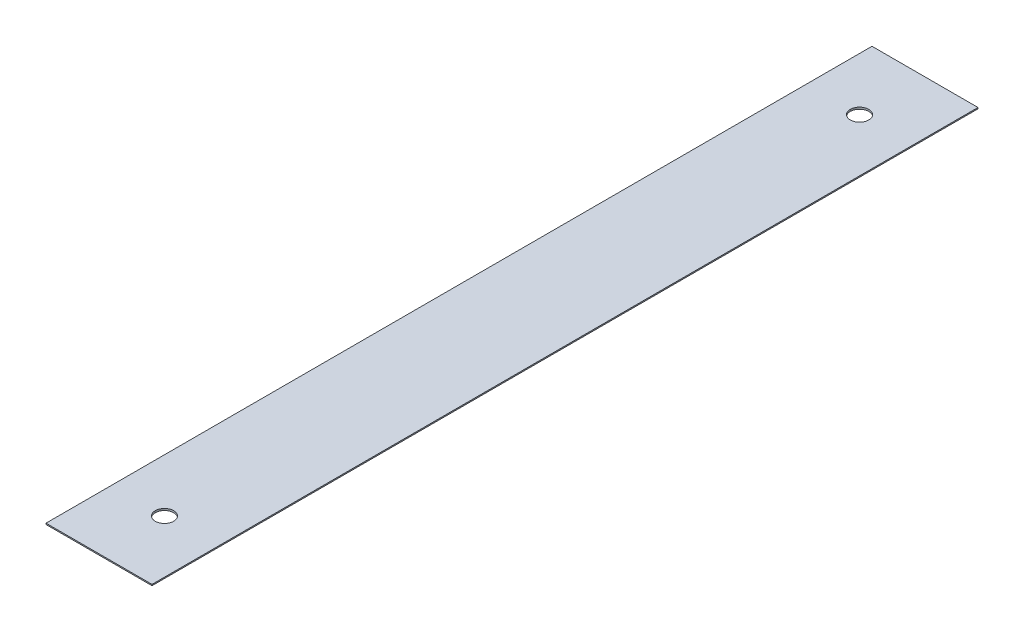
ISO-10303-21;
HEADER;
FILE_DESCRIPTION(('STEP AP214'),'2;1');
FILE_NAME('part.step','',(''),(''),'','','');
FILE_SCHEMA(('AUTOMOTIVE_DESIGN { 1 0 10303 214 1 1 1 1 }'));
ENDSEC;
DATA;
#1=APPLICATION_CONTEXT('core data for automotive mechanical design processes');
#2=APPLICATION_PROTOCOL_DEFINITION('international standard','automotive_design',2000,#1);
#3=PRODUCT_CONTEXT('',#1,'mechanical');
#4=PRODUCT('Part','Part','',(#3));
#5=PRODUCT_RELATED_PRODUCT_CATEGORY('part','',(#4));
#6=PRODUCT_DEFINITION_FORMATION('','',#4);
#7=PRODUCT_DEFINITION_CONTEXT('part definition',#1,'design');
#8=PRODUCT_DEFINITION('design','',#6,#7);
#9=PRODUCT_DEFINITION_SHAPE('','',#8);
#10=(LENGTH_UNIT() NAMED_UNIT(*) SI_UNIT(.MILLI.,.METRE.));
#11=(NAMED_UNIT(*) PLANE_ANGLE_UNIT() SI_UNIT($,.RADIAN.));
#12=(NAMED_UNIT(*) SI_UNIT($,.STERADIAN.) SOLID_ANGLE_UNIT());
#13=UNCERTAINTY_MEASURE_WITH_UNIT(LENGTH_MEASURE(1.E-05),#10,'distance_accuracy_value','');
#14=(GEOMETRIC_REPRESENTATION_CONTEXT(3) GLOBAL_UNCERTAINTY_ASSIGNED_CONTEXT((#13)) GLOBAL_UNIT_ASSIGNED_CONTEXT((#10,
#11,#12)) REPRESENTATION_CONTEXT('',''));
#15=CARTESIAN_POINT('',(0.,0.,0.));
#16=DIRECTION('',(0.,0.,1.));
#17=DIRECTION('',(1.,0.,0.));
#18=AXIS2_PLACEMENT_3D('',#15,#16,#17);
#19=CARTESIAN_POINT('',(-260.,-1088.5,1915.));
#20=DIRECTION('',(0.,-1.,0.));
#21=DIRECTION('',(0.,0.,1.));
#22=AXIS2_PLACEMENT_3D('',#19,#20,#21);
#23=PLANE('',#22);
#24=DIRECTION('',(-1.,0.,0.));
#25=VECTOR('',#24,1.);
#26=CARTESIAN_POINT('',(688.3,-1088.5,1732.3));
#27=LINE('',#26,#25);
#28=CARTESIAN_POINT('',(688.3,-1088.5,1732.3));
#29=VERTEX_POINT('',#28);
#30=CARTESIAN_POINT('',(574.7,-1088.5,1732.3));
#31=VERTEX_POINT('',#30);
#32=EDGE_CURVE('E11',#29,#31,#27,.T.);
#33=ORIENTED_EDGE('',*,*,#32,.T.);
#34=DIRECTION('',(0.,0.,-1.));
#35=VECTOR('',#34,1.);
#36=CARTESIAN_POINT('',(574.7,-1088.5,1732.3));
#37=LINE('',#36,#35);
#38=CARTESIAN_POINT('',(574.7,-1088.5,837.7));
#39=VERTEX_POINT('',#38);
#40=EDGE_CURVE('E27',#31,#39,#37,.T.);
#41=ORIENTED_EDGE('',*,*,#40,.T.);
#42=DIRECTION('',(1.,0.,0.));
#43=VECTOR('',#42,1.);
#44=CARTESIAN_POINT('',(574.7,-1088.5,837.7));
#45=LINE('',#44,#43);
#46=CARTESIAN_POINT('',(688.3,-1088.5,837.7));
#47=VERTEX_POINT('',#46);
#48=EDGE_CURVE('E134',#39,#47,#45,.T.);
#49=ORIENTED_EDGE('',*,*,#48,.T.);
#50=DIRECTION('',(0.,0.,1.));
#51=VECTOR('',#50,1.);
#52=CARTESIAN_POINT('',(688.3,-1088.5,837.7));
#53=LINE('',#52,#51);
#54=EDGE_CURVE('E171',#47,#29,#53,.T.);
#55=ORIENTED_EDGE('',*,*,#54,.T.);
#56=EDGE_LOOP('',(#33,#41,#49,#55));
#57=FACE_BOUND('',#56,.T.);
#58=CARTESIAN_POINT('',(631.5,-1088.5,1662.));
#59=DIRECTION('',(0.,-1.,0.));
#60=DIRECTION('',(-1.,0.,0.));
#61=AXIS2_PLACEMENT_3D('',#58,#59,#60);
#62=CIRCLE('',#61,10.);
#63=CARTESIAN_POINT('',(621.5,-1088.5,1662.));
#64=VERTEX_POINT('',#63);
#65=CARTESIAN_POINT('',(641.5,-1088.5,1662.));
#66=VERTEX_POINT('',#65);
#67=EDGE_CURVE('E139',#64,#66,#62,.T.);
#68=ORIENTED_EDGE('',*,*,#67,.F.);
#69=CARTESIAN_POINT('',(631.5,-1088.5,1662.));
#70=DIRECTION('',(0.,-1.,0.));
#71=DIRECTION('',(1.,0.,0.));
#72=AXIS2_PLACEMENT_3D('',#69,#70,#71);
#73=CIRCLE('',#72,10.);
#74=EDGE_CURVE('E138',#66,#64,#73,.T.);
#75=ORIENTED_EDGE('',*,*,#74,.F.);
#76=EDGE_LOOP('',(#68,#75));
#77=FACE_BOUND('',#76,.T.);
#78=CARTESIAN_POINT('',(631.5,-1088.5,908.));
#79=DIRECTION('',(0.,-1.,0.));
#80=DIRECTION('',(-1.,0.,0.));
#81=AXIS2_PLACEMENT_3D('',#78,#79,#80);
#82=CIRCLE('',#81,10.);
#83=CARTESIAN_POINT('',(621.5,-1088.5,908.));
#84=VERTEX_POINT('',#83);
#85=CARTESIAN_POINT('',(641.5,-1088.5,908.));
#86=VERTEX_POINT('',#85);
#87=EDGE_CURVE('E164',#84,#86,#82,.T.);
#88=ORIENTED_EDGE('',*,*,#87,.F.);
#89=CARTESIAN_POINT('',(631.5,-1088.5,908.));
#90=DIRECTION('',(0.,-1.,0.));
#91=DIRECTION('',(1.,0.,0.));
#92=AXIS2_PLACEMENT_3D('',#89,#90,#91);
#93=CIRCLE('',#92,10.);
#94=EDGE_CURVE('E177',#86,#84,#93,.T.);
#95=ORIENTED_EDGE('',*,*,#94,.F.);
#96=EDGE_LOOP('',(#88,#95));
#97=FACE_BOUND('',#96,.T.);
#98=ADVANCED_FACE('F17',(#57,#77,#97),#23,.T.);
#99=CARTESIAN_POINT('',(631.5,-1088.5,1662.));
#100=DIRECTION('',(0.,-1.,0.));
#101=DIRECTION('',(1.,0.,0.));
#102=AXIS2_PLACEMENT_3D('',#99,#100,#101);
#103=CYLINDRICAL_SURFACE('',#102,10.);
#104=DIRECTION('',(0.,1.,0.));
#105=VECTOR('',#104,1.);
#106=CARTESIAN_POINT('',(621.5,-1088.5,1662.));
#107=LINE('',#106,#105);
#108=CARTESIAN_POINT('',(621.5,-1086.5,1662.));
#109=VERTEX_POINT('',#108);
#110=EDGE_CURVE('E173',#64,#109,#107,.T.);
#111=ORIENTED_EDGE('',*,*,#110,.T.);
#112=CARTESIAN_POINT('',(631.5,-1086.5,1662.));
#113=DIRECTION('',(0.,-1.,0.));
#114=DIRECTION('',(1.,0.,0.));
#115=AXIS2_PLACEMENT_3D('',#112,#113,#114);
#116=CIRCLE('',#115,10.);
#117=CARTESIAN_POINT('',(641.5,-1086.5,1662.));
#118=VERTEX_POINT('',#117);
#119=EDGE_CURVE('E131',#118,#109,#116,.T.);
#120=ORIENTED_EDGE('',*,*,#119,.F.);
#121=DIRECTION('',(0.,1.,0.));
#122=VECTOR('',#121,1.);
#123=CARTESIAN_POINT('',(641.5,-1088.5,1662.));
#124=LINE('',#123,#122);
#125=EDGE_CURVE('E135',#66,#118,#124,.T.);
#126=ORIENTED_EDGE('',*,*,#125,.F.);
#127=ORIENTED_EDGE('',*,*,#74,.T.);
#128=EDGE_LOOP('',(#111,#120,#126,#127));
#129=FACE_BOUND('',#128,.T.);
#130=ADVANCED_FACE('F206',(#129),#103,.F.);
#131=CARTESIAN_POINT('',(631.5,-1088.5,1662.));
#132=DIRECTION('',(0.,-1.,0.));
#133=DIRECTION('',(1.,0.,0.));
#134=AXIS2_PLACEMENT_3D('',#131,#132,#133);
#135=CYLINDRICAL_SURFACE('',#134,10.);
#136=ORIENTED_EDGE('',*,*,#125,.T.);
#137=CARTESIAN_POINT('',(631.5,-1086.5,1662.));
#138=DIRECTION('',(0.,-1.,0.));
#139=DIRECTION('',(-1.,0.,0.));
#140=AXIS2_PLACEMENT_3D('',#137,#138,#139);
#141=CIRCLE('',#140,10.);
#142=EDGE_CURVE('E126',#109,#118,#141,.T.);
#143=ORIENTED_EDGE('',*,*,#142,.F.);
#144=ORIENTED_EDGE('',*,*,#110,.F.);
#145=ORIENTED_EDGE('',*,*,#67,.T.);
#146=EDGE_LOOP('',(#136,#143,#144,#145));
#147=FACE_BOUND('',#146,.T.);
#148=ADVANCED_FACE('F212',(#147),#135,.F.);
#149=CARTESIAN_POINT('',(-260.,-1086.5,1915.));
#150=DIRECTION('',(0.,-1.,0.));
#151=DIRECTION('',(0.,0.,1.));
#152=AXIS2_PLACEMENT_3D('',#149,#150,#151);
#153=PLANE('',#152);
#154=DIRECTION('',(0.,0.,-1.));
#155=VECTOR('',#154,1.);
#156=CARTESIAN_POINT('',(574.,-1086.5,1733.));
#157=LINE('',#156,#155);
#158=CARTESIAN_POINT('',(574.,-1086.5,1733.));
#159=VERTEX_POINT('',#158);
#160=CARTESIAN_POINT('',(574.,-1086.5,837.));
#161=VERTEX_POINT('',#160);
#162=EDGE_CURVE('E112',#159,#161,#157,.T.);
#163=ORIENTED_EDGE('',*,*,#162,.F.);
#164=DIRECTION('',(-1.,0.,0.));
#165=VECTOR('',#164,1.);
#166=CARTESIAN_POINT('',(689.,-1086.5,1733.));
#167=LINE('',#166,#165);
#168=CARTESIAN_POINT('',(689.,-1086.5,1733.));
#169=VERTEX_POINT('',#168);
#170=EDGE_CURVE('E99',#169,#159,#167,.T.);
#171=ORIENTED_EDGE('',*,*,#170,.F.);
#172=DIRECTION('',(0.,0.,1.));
#173=VECTOR('',#172,1.);
#174=CARTESIAN_POINT('',(689.,-1086.5,837.));
#175=LINE('',#174,#173);
#176=CARTESIAN_POINT('',(689.,-1086.5,837.));
#177=VERTEX_POINT('',#176);
#178=EDGE_CURVE('E151',#177,#169,#175,.T.);
#179=ORIENTED_EDGE('',*,*,#178,.F.);
#180=DIRECTION('',(1.,0.,0.));
#181=VECTOR('',#180,1.);
#182=CARTESIAN_POINT('',(574.,-1086.5,837.));
#183=LINE('',#182,#181);
#184=EDGE_CURVE('E153',#161,#177,#183,.T.);
#185=ORIENTED_EDGE('',*,*,#184,.F.);
#186=EDGE_LOOP('',(#163,#171,#179,#185));
#187=FACE_BOUND('',#186,.T.);
#188=ORIENTED_EDGE('',*,*,#142,.T.);
#189=ORIENTED_EDGE('',*,*,#119,.T.);
#190=EDGE_LOOP('',(#188,#189));
#191=FACE_BOUND('',#190,.T.);
#192=CARTESIAN_POINT('',(631.5,-1086.5,908.));
#193=DIRECTION('',(0.,-1.,0.));
#194=DIRECTION('',(-1.,0.,0.));
#195=AXIS2_PLACEMENT_3D('',#192,#193,#194);
#196=CIRCLE('',#195,10.);
#197=CARTESIAN_POINT('',(621.5,-1086.5,908.));
#198=VERTEX_POINT('',#197);
#199=CARTESIAN_POINT('',(641.5,-1086.5,908.));
#200=VERTEX_POINT('',#199);
#201=EDGE_CURVE('E128',#198,#200,#196,.T.);
#202=ORIENTED_EDGE('',*,*,#201,.T.);
#203=CARTESIAN_POINT('',(631.5,-1086.5,908.));
#204=DIRECTION('',(0.,-1.,0.));
#205=DIRECTION('',(1.,0.,0.));
#206=AXIS2_PLACEMENT_3D('',#203,#204,#205);
#207=CIRCLE('',#206,10.);
#208=EDGE_CURVE('E132',#200,#198,#207,.T.);
#209=ORIENTED_EDGE('',*,*,#208,.T.);
#210=EDGE_LOOP('',(#202,#209));
#211=FACE_BOUND('',#210,.T.);
#212=ADVANCED_FACE('F183',(#187,#191,#211),#153,.F.);
#213=CARTESIAN_POINT('',(574.,-1088.5,837.));
#214=DIRECTION('',(0.,0.,-1.));
#215=DIRECTION('',(1.,0.,0.));
#216=AXIS2_PLACEMENT_3D('',#213,#214,#215);
#217=PLANE('',#216);
#218=DIRECTION('',(0.,1.,0.));
#219=VECTOR('',#218,1.);
#220=CARTESIAN_POINT('',(574.,-1087.8,837.));
#221=LINE('',#220,#219);
#222=CARTESIAN_POINT('',(574.,-1087.8,837.));
#223=VERTEX_POINT('',#222);
#224=EDGE_CURVE('E117',#223,#161,#221,.T.);
#225=ORIENTED_EDGE('',*,*,#224,.T.);
#226=ORIENTED_EDGE('',*,*,#184,.T.);
#227=DIRECTION('',(0.,1.,0.));
#228=VECTOR('',#227,1.);
#229=CARTESIAN_POINT('',(689.,-1087.8,837.));
#230=LINE('',#229,#228);
#231=CARTESIAN_POINT('',(689.,-1087.8,837.));
#232=VERTEX_POINT('',#231);
#233=EDGE_CURVE('E148',#232,#177,#230,.T.);
#234=ORIENTED_EDGE('',*,*,#233,.F.);
#235=DIRECTION('',(1.,0.,0.));
#236=VECTOR('',#235,1.);
#237=CARTESIAN_POINT('',(574.,-1087.8,837.));
#238=LINE('',#237,#236);
#239=EDGE_CURVE('E118',#223,#232,#238,.T.);
#240=ORIENTED_EDGE('',*,*,#239,.F.);
#241=EDGE_LOOP('',(#225,#226,#234,#240));
#242=FACE_BOUND('',#241,.T.);
#243=ADVANCED_FACE('F186',(#242),#217,.T.);
#244=CARTESIAN_POINT('',(631.5,-1088.15,837.35));
#245=DIRECTION('',(0.,-0.707106781186598,-0.707106781186498));
#246=DIRECTION('',(1.,0.,0.));
#247=AXIS2_PLACEMENT_3D('',#244,#245,#246);
#248=PLANE('',#247);
#249=DIRECTION('',(-0.577350269189626,-0.577350269189626,0.577350269189626));
#250=VECTOR('',#249,1.);
#251=CARTESIAN_POINT('',(689.,-1087.8,837.));
#252=LINE('',#251,#250);
#253=EDGE_CURVE('E145',#232,#47,#252,.T.);
#254=ORIENTED_EDGE('',*,*,#253,.T.);
#255=ORIENTED_EDGE('',*,*,#48,.F.);
#256=DIRECTION('',(0.577350269189592,-0.577350269189592,0.577350269189693));
#257=VECTOR('',#256,1.);
#258=CARTESIAN_POINT('',(574.,-1087.8,837.));
#259=LINE('',#258,#257);
#260=EDGE_CURVE('E111',#223,#39,#259,.T.);
#261=ORIENTED_EDGE('',*,*,#260,.F.);
#262=ORIENTED_EDGE('',*,*,#239,.T.);
#263=EDGE_LOOP('',(#254,#255,#261,#262));
#264=FACE_BOUND('',#263,.T.);
#265=ADVANCED_FACE('F187',(#264),#248,.T.);
#266=CARTESIAN_POINT('',(574.35,-1088.15,1285.));
#267=DIRECTION('',(-0.707106781186498,-0.707106781186598,0.));
#268=DIRECTION('',(0.,0.,-1.));
#269=AXIS2_PLACEMENT_3D('',#266,#267,#268);
#270=PLANE('',#269);
#271=DIRECTION('',(0.577350269189626,-0.577350269189626,-0.577350269189626));
#272=VECTOR('',#271,1.);
#273=CARTESIAN_POINT('',(574.,-1087.8,1733.));
#274=LINE('',#273,#272);
#275=CARTESIAN_POINT('',(574.,-1087.8,1733.));
#276=VERTEX_POINT('',#275);
#277=EDGE_CURVE('E94',#276,#31,#274,.T.);
#278=ORIENTED_EDGE('',*,*,#277,.F.);
#279=DIRECTION('',(0.,0.,-1.));
#280=VECTOR('',#279,1.);
#281=CARTESIAN_POINT('',(574.,-1087.8,1733.));
#282=LINE('',#281,#280);
#283=EDGE_CURVE('E98',#276,#223,#282,.T.);
#284=ORIENTED_EDGE('',*,*,#283,.T.);
#285=ORIENTED_EDGE('',*,*,#260,.T.);
#286=ORIENTED_EDGE('',*,*,#40,.F.);
#287=EDGE_LOOP('',(#278,#284,#285,#286));
#288=FACE_BOUND('',#287,.T.);
#289=ADVANCED_FACE('F96',(#288),#270,.T.);
#290=CARTESIAN_POINT('',(574.,-1088.5,1733.));
#291=DIRECTION('',(-1.,0.,0.));
#292=DIRECTION('',(0.,-1.,0.));
#293=AXIS2_PLACEMENT_3D('',#290,#291,#292);
#294=PLANE('',#293);
#295=DIRECTION('',(0.,1.,0.));
#296=VECTOR('',#295,1.);
#297=CARTESIAN_POINT('',(574.,-1087.8,1733.));
#298=LINE('',#297,#296);
#299=EDGE_CURVE('E104',#276,#159,#298,.T.);
#300=ORIENTED_EDGE('',*,*,#299,.T.);
#301=ORIENTED_EDGE('',*,*,#162,.T.);
#302=ORIENTED_EDGE('',*,*,#224,.F.);
#303=ORIENTED_EDGE('',*,*,#283,.F.);
#304=EDGE_LOOP('',(#300,#301,#302,#303));
#305=FACE_BOUND('',#304,.T.);
#306=ADVANCED_FACE('F115',(#305),#294,.T.);
#307=CARTESIAN_POINT('',(689.,-1088.5,1733.));
#308=DIRECTION('',(0.,0.,1.));
#309=DIRECTION('',(0.,-1.,0.));
#310=AXIS2_PLACEMENT_3D('',#307,#308,#309);
#311=PLANE('',#310);
#312=DIRECTION('',(0.,1.,0.));
#313=VECTOR('',#312,1.);
#314=CARTESIAN_POINT('',(689.,-1087.8,1733.));
#315=LINE('',#314,#313);
#316=CARTESIAN_POINT('',(689.,-1087.8,1733.));
#317=VERTEX_POINT('',#316);
#318=EDGE_CURVE('E141',#317,#169,#315,.T.);
#319=ORIENTED_EDGE('',*,*,#318,.T.);
#320=ORIENTED_EDGE('',*,*,#170,.T.);
#321=ORIENTED_EDGE('',*,*,#299,.F.);
#322=DIRECTION('',(-1.,0.,0.));
#323=VECTOR('',#322,1.);
#324=CARTESIAN_POINT('',(689.,-1087.8,1733.));
#325=LINE('',#324,#323);
#326=EDGE_CURVE('E100',#317,#276,#325,.T.);
#327=ORIENTED_EDGE('',*,*,#326,.F.);
#328=EDGE_LOOP('',(#319,#320,#321,#327));
#329=FACE_BOUND('',#328,.T.);
#330=ADVANCED_FACE('F106',(#329),#311,.T.);
#331=CARTESIAN_POINT('',(631.5,-1088.15,1732.65));
#332=DIRECTION('',(0.,-0.707106781186498,0.707106781186598));
#333=DIRECTION('',(1.,0.,0.));
#334=AXIS2_PLACEMENT_3D('',#331,#332,#333);
#335=PLANE('',#334);
#336=ORIENTED_EDGE('',*,*,#277,.T.);
#337=ORIENTED_EDGE('',*,*,#32,.F.);
#338=DIRECTION('',(-0.577350269189693,-0.577350269189592,-0.577350269189592));
#339=VECTOR('',#338,1.);
#340=CARTESIAN_POINT('',(689.,-1087.8,1733.));
#341=LINE('',#340,#339);
#342=EDGE_CURVE('E90',#317,#29,#341,.T.);
#343=ORIENTED_EDGE('',*,*,#342,.F.);
#344=ORIENTED_EDGE('',*,*,#326,.T.);
#345=EDGE_LOOP('',(#336,#337,#343,#344));
#346=FACE_BOUND('',#345,.T.);
#347=ADVANCED_FACE('F120',(#346),#335,.T.);
#348=CARTESIAN_POINT('',(688.65,-1088.15,1285.));
#349=DIRECTION('',(0.707106781186498,-0.707106781186598,0.));
#350=DIRECTION('',(0.,0.,-1.));
#351=AXIS2_PLACEMENT_3D('',#348,#349,#350);
#352=PLANE('',#351);
#353=ORIENTED_EDGE('',*,*,#342,.T.);
#354=ORIENTED_EDGE('',*,*,#54,.F.);
#355=ORIENTED_EDGE('',*,*,#253,.F.);
#356=DIRECTION('',(0.,0.,1.));
#357=VECTOR('',#356,1.);
#358=CARTESIAN_POINT('',(689.,-1087.8,837.));
#359=LINE('',#358,#357);
#360=EDGE_CURVE('E122',#232,#317,#359,.T.);
#361=ORIENTED_EDGE('',*,*,#360,.T.);
#362=EDGE_LOOP('',(#353,#354,#355,#361));
#363=FACE_BOUND('',#362,.T.);
#364=ADVANCED_FACE('F190',(#363),#352,.T.);
#365=CARTESIAN_POINT('',(689.,-1088.5,837.));
#366=DIRECTION('',(1.,0.,0.));
#367=DIRECTION('',(0.,0.,-1.));
#368=AXIS2_PLACEMENT_3D('',#365,#366,#367);
#369=PLANE('',#368);
#370=ORIENTED_EDGE('',*,*,#233,.T.);
#371=ORIENTED_EDGE('',*,*,#178,.T.);
#372=ORIENTED_EDGE('',*,*,#318,.F.);
#373=ORIENTED_EDGE('',*,*,#360,.F.);
#374=EDGE_LOOP('',(#370,#371,#372,#373));
#375=FACE_BOUND('',#374,.T.);
#376=ADVANCED_FACE('F192',(#375),#369,.T.);
#377=CARTESIAN_POINT('',(631.5,-1088.5,908.));
#378=DIRECTION('',(0.,-1.,0.));
#379=DIRECTION('',(1.,0.,0.));
#380=AXIS2_PLACEMENT_3D('',#377,#378,#379);
#381=CYLINDRICAL_SURFACE('',#380,10.);
#382=DIRECTION('',(0.,1.,0.));
#383=VECTOR('',#382,1.);
#384=CARTESIAN_POINT('',(621.5,-1088.5,908.));
#385=LINE('',#384,#383);
#386=EDGE_CURVE('E174',#84,#198,#385,.T.);
#387=ORIENTED_EDGE('',*,*,#386,.T.);
#388=ORIENTED_EDGE('',*,*,#208,.F.);
#389=DIRECTION('',(0.,1.,0.));
#390=VECTOR('',#389,1.);
#391=CARTESIAN_POINT('',(641.5,-1088.5,908.));
#392=LINE('',#391,#390);
#393=EDGE_CURVE('E21',#86,#200,#392,.T.);
#394=ORIENTED_EDGE('',*,*,#393,.F.);
#395=ORIENTED_EDGE('',*,*,#94,.T.);
#396=EDGE_LOOP('',(#387,#388,#394,#395));
#397=FACE_BOUND('',#396,.T.);
#398=ADVANCED_FACE('F194',(#397),#381,.F.);
#399=CARTESIAN_POINT('',(631.5,-1088.5,908.));
#400=DIRECTION('',(0.,-1.,0.));
#401=DIRECTION('',(1.,0.,0.));
#402=AXIS2_PLACEMENT_3D('',#399,#400,#401);
#403=CYLINDRICAL_SURFACE('',#402,10.);
#404=ORIENTED_EDGE('',*,*,#393,.T.);
#405=ORIENTED_EDGE('',*,*,#201,.F.);
#406=ORIENTED_EDGE('',*,*,#386,.F.);
#407=ORIENTED_EDGE('',*,*,#87,.T.);
#408=EDGE_LOOP('',(#404,#405,#406,#407));
#409=FACE_BOUND('',#408,.T.);
#410=ADVANCED_FACE('F19',(#409),#403,.F.);
#411=CLOSED_SHELL('',(#98,#130,#148,#212,#243,#265,#289,#306,#330,#347,#364,#376,#398,#410));
#412=MANIFOLD_SOLID_BREP('B1',#411);
#413=ADVANCED_BREP_SHAPE_REPRESENTATION('',(#18,#412),#14);
#414=SHAPE_DEFINITION_REPRESENTATION(#9,#413);
ENDSEC;
END-ISO-10303-21;
